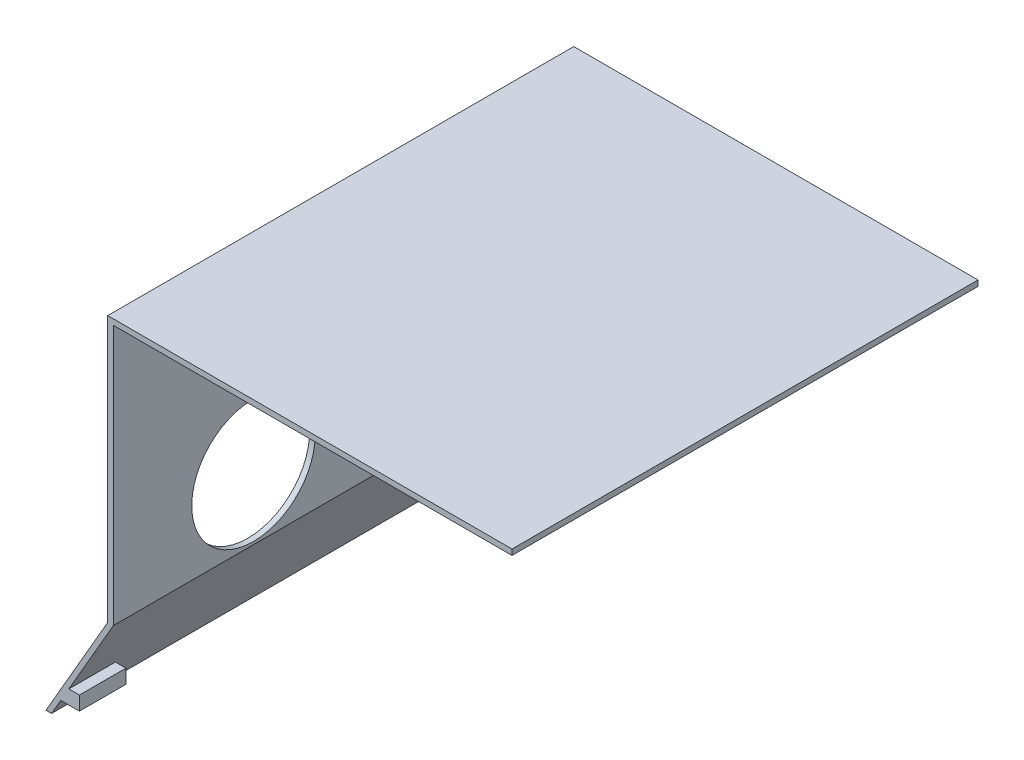
ISO-10303-21;
HEADER;
FILE_DESCRIPTION(('STEP AP214'),'2;1');
FILE_NAME('part.step','',(''),(''),'','','');
FILE_SCHEMA(('AUTOMOTIVE_DESIGN { 1 0 10303 214 1 1 1 1 }'));
ENDSEC;
DATA;
#1=APPLICATION_CONTEXT('core data for automotive mechanical design processes');
#2=APPLICATION_PROTOCOL_DEFINITION('international standard','automotive_design',2000,#1);
#3=PRODUCT_CONTEXT('',#1,'mechanical');
#4=PRODUCT('Part','Part','',(#3));
#5=PRODUCT_RELATED_PRODUCT_CATEGORY('part','',(#4));
#6=PRODUCT_DEFINITION_FORMATION('','',#4);
#7=PRODUCT_DEFINITION_CONTEXT('part definition',#1,'design');
#8=PRODUCT_DEFINITION('design','',#6,#7);
#9=PRODUCT_DEFINITION_SHAPE('','',#8);
#10=(LENGTH_UNIT() NAMED_UNIT(*) SI_UNIT(.MILLI.,.METRE.));
#11=(NAMED_UNIT(*) PLANE_ANGLE_UNIT() SI_UNIT($,.RADIAN.));
#12=(NAMED_UNIT(*) SI_UNIT($,.STERADIAN.) SOLID_ANGLE_UNIT());
#13=UNCERTAINTY_MEASURE_WITH_UNIT(LENGTH_MEASURE(1.E-05),#10,'distance_accuracy_value','');
#14=(GEOMETRIC_REPRESENTATION_CONTEXT(3) GLOBAL_UNCERTAINTY_ASSIGNED_CONTEXT((#13)) GLOBAL_UNIT_ASSIGNED_CONTEXT((#10,
#11,#12)) REPRESENTATION_CONTEXT('',''));
#15=CARTESIAN_POINT('',(0.,0.,0.));
#16=DIRECTION('',(0.,0.,1.));
#17=DIRECTION('',(1.,0.,0.));
#18=AXIS2_PLACEMENT_3D('',#15,#16,#17);
#19=CARTESIAN_POINT('',(100.,79.9596732002877,-100.));
#20=DIRECTION('',(0.,1.,0.));
#21=DIRECTION('',(-1.,0.,0.));
#22=AXIS2_PLACEMENT_3D('',#19,#20,#21);
#23=PLANE('',#22);
#24=DIRECTION('',(-1.,0.,0.));
#25=VECTOR('',#24,1.);
#26=CARTESIAN_POINT('',(100.,79.9596732002877,0.));
#27=LINE('',#26,#25);
#28=CARTESIAN_POINT('',(100.,79.9596732002877,0.));
#29=VERTEX_POINT('',#28);
#30=CARTESIAN_POINT('',(13.2499999999999,79.9596732002877,0.));
#31=VERTEX_POINT('',#30);
#32=EDGE_CURVE('E232',#29,#31,#27,.T.);
#33=ORIENTED_EDGE('',*,*,#32,.F.);
#34=DIRECTION('',(0.,0.,1.));
#35=VECTOR('',#34,1.);
#36=CARTESIAN_POINT('',(100.,79.9596732002877,-100.));
#37=LINE('',#36,#35);
#38=CARTESIAN_POINT('',(100.,79.9596732002877,-100.));
#39=VERTEX_POINT('',#38);
#40=EDGE_CURVE('E11',#39,#29,#37,.T.);
#41=ORIENTED_EDGE('',*,*,#40,.F.);
#42=DIRECTION('',(-1.,0.,0.));
#43=VECTOR('',#42,1.);
#44=CARTESIAN_POINT('',(100.,79.9596732002877,-100.));
#45=LINE('',#44,#43);
#46=CARTESIAN_POINT('',(13.2499999999999,79.9596732002877,-100.));
#47=VERTEX_POINT('',#46);
#48=EDGE_CURVE('E242',#39,#47,#45,.T.);
#49=ORIENTED_EDGE('',*,*,#48,.T.);
#50=DIRECTION('',(0.,0.,1.));
#51=VECTOR('',#50,1.);
#52=CARTESIAN_POINT('',(13.2499999999999,79.9596732002877,-100.));
#53=LINE('',#52,#51);
#54=EDGE_CURVE('E42',#47,#31,#53,.T.);
#55=ORIENTED_EDGE('',*,*,#54,.T.);
#56=EDGE_LOOP('',(#33,#41,#49,#55));
#57=FACE_BOUND('',#56,.T.);
#58=ADVANCED_FACE('F39',(#57),#23,.T.);
#59=CARTESIAN_POINT('',(99.9999999999999,78.7596732002877,-100.));
#60=DIRECTION('',(1.,0.,0.));
#61=DIRECTION('',(0.,1.,0.));
#62=AXIS2_PLACEMENT_3D('',#59,#60,#61);
#63=PLANE('',#62);
#64=DIRECTION('',(0.,1.,0.));
#65=VECTOR('',#64,1.);
#66=CARTESIAN_POINT('',(99.9999999999999,78.7596732002877,0.));
#67=LINE('',#66,#65);
#68=CARTESIAN_POINT('',(99.9999999999999,78.7596732002877,0.));
#69=VERTEX_POINT('',#68);
#70=EDGE_CURVE('E247',#69,#29,#67,.T.);
#71=ORIENTED_EDGE('',*,*,#70,.F.);
#72=DIRECTION('',(0.,0.,1.));
#73=VECTOR('',#72,1.);
#74=CARTESIAN_POINT('',(99.9999999999999,78.7596732002877,-100.));
#75=LINE('',#74,#73);
#76=CARTESIAN_POINT('',(99.9999999999999,78.7596732002877,-100.));
#77=VERTEX_POINT('',#76);
#78=EDGE_CURVE('E48',#77,#69,#75,.T.);
#79=ORIENTED_EDGE('',*,*,#78,.F.);
#80=DIRECTION('',(0.,1.,0.));
#81=VECTOR('',#80,1.);
#82=CARTESIAN_POINT('',(99.9999999999999,78.7596732002877,-100.));
#83=LINE('',#82,#81);
#84=EDGE_CURVE('E271',#77,#39,#83,.T.);
#85=ORIENTED_EDGE('',*,*,#84,.T.);
#86=ORIENTED_EDGE('',*,*,#40,.T.);
#87=EDGE_LOOP('',(#71,#79,#85,#86));
#88=FACE_BOUND('',#87,.T.);
#89=ADVANCED_FACE('F336',(#88),#63,.T.);
#90=CARTESIAN_POINT('',(14.4499999999999,78.7596732002877,-100.));
#91=DIRECTION('',(0.,-1.,0.));
#92=DIRECTION('',(1.,0.,0.));
#93=AXIS2_PLACEMENT_3D('',#90,#91,#92);
#94=PLANE('',#93);
#95=DIRECTION('',(1.,0.,0.));
#96=VECTOR('',#95,1.);
#97=CARTESIAN_POINT('',(14.4499999999999,78.7596732002877,0.));
#98=LINE('',#97,#96);
#99=CARTESIAN_POINT('',(14.4499999999999,78.7596732002877,0.));
#100=VERTEX_POINT('',#99);
#101=EDGE_CURVE('E299',#100,#69,#98,.T.);
#102=ORIENTED_EDGE('',*,*,#101,.F.);
#103=DIRECTION('',(0.,0.,1.));
#104=VECTOR('',#103,1.);
#105=CARTESIAN_POINT('',(14.4499999999999,78.7596732002877,-100.));
#106=LINE('',#105,#104);
#107=CARTESIAN_POINT('',(14.4499999999999,78.7596732002877,-100.));
#108=VERTEX_POINT('',#107);
#109=EDGE_CURVE('E308',#108,#100,#106,.T.);
#110=ORIENTED_EDGE('',*,*,#109,.F.);
#111=DIRECTION('',(1.,0.,0.));
#112=VECTOR('',#111,1.);
#113=CARTESIAN_POINT('',(14.4499999999999,78.7596732002877,-100.));
#114=LINE('',#113,#112);
#115=EDGE_CURVE('E267',#108,#77,#114,.T.);
#116=ORIENTED_EDGE('',*,*,#115,.T.);
#117=ORIENTED_EDGE('',*,*,#78,.T.);
#118=EDGE_LOOP('',(#102,#110,#116,#117));
#119=FACE_BOUND('',#118,.T.);
#120=ADVANCED_FACE('F374',(#119),#94,.T.);
#121=CARTESIAN_POINT('',(14.4499999999999,22.9496732002877,-100.));
#122=DIRECTION('',(1.,0.,0.));
#123=DIRECTION('',(0.,0.,-1.));
#124=AXIS2_PLACEMENT_3D('',#121,#122,#123);
#125=PLANE('',#124);
#126=CARTESIAN_POINT('',(14.4499999999999,36.8,-69.6));
#127=DIRECTION('',(1.,0.,0.));
#128=DIRECTION('',(0.,0.,-1.));
#129=AXIS2_PLACEMENT_3D('',#126,#127,#128);
#130=CIRCLE('',#129,13.25);
#131=CARTESIAN_POINT('',(14.4499999999999,36.8,-82.85));
#132=VERTEX_POINT('',#131);
#133=EDGE_CURVE('E188',#132,#132,#130,.T.);
#134=ORIENTED_EDGE('',*,*,#133,.F.);
#135=EDGE_LOOP('',(#134));
#136=FACE_BOUND('',#135,.T.);
#137=CARTESIAN_POINT('',(14.4499999999999,36.8,-30.07));
#138=DIRECTION('',(1.,0.,0.));
#139=DIRECTION('',(0.,0.,-1.));
#140=AXIS2_PLACEMENT_3D('',#137,#138,#139);
#141=CIRCLE('',#140,13.25);
#142=CARTESIAN_POINT('',(14.4499999999999,36.8,-43.32));
#143=VERTEX_POINT('',#142);
#144=EDGE_CURVE('E548',#143,#143,#141,.T.);
#145=ORIENTED_EDGE('',*,*,#144,.F.);
#146=EDGE_LOOP('',(#145));
#147=FACE_BOUND('',#146,.T.);
#148=DIRECTION('',(0.,1.,0.));
#149=VECTOR('',#148,1.);
#150=CARTESIAN_POINT('',(14.4499999999999,22.9496732002877,0.));
#151=LINE('',#150,#149);
#152=CARTESIAN_POINT('',(14.4499999999999,22.9496732002877,0.));
#153=VERTEX_POINT('',#152);
#154=EDGE_CURVE('E295',#153,#100,#151,.T.);
#155=ORIENTED_EDGE('',*,*,#154,.F.);
#156=DIRECTION('',(0.,0.,1.));
#157=VECTOR('',#156,1.);
#158=CARTESIAN_POINT('',(14.4499999999999,22.9496732002877,-100.));
#159=LINE('',#158,#157);
#160=CARTESIAN_POINT('',(14.4499999999999,22.9496732002877,-100.));
#161=VERTEX_POINT('',#160);
#162=EDGE_CURVE('E311',#161,#153,#159,.T.);
#163=ORIENTED_EDGE('',*,*,#162,.F.);
#164=DIRECTION('',(0.,1.,0.));
#165=VECTOR('',#164,1.);
#166=CARTESIAN_POINT('',(14.4499999999999,22.9496732002877,-100.));
#167=LINE('',#166,#165);
#168=EDGE_CURVE('E263',#161,#108,#167,.T.);
#169=ORIENTED_EDGE('',*,*,#168,.T.);
#170=ORIENTED_EDGE('',*,*,#109,.T.);
#171=EDGE_LOOP('',(#155,#163,#169,#170));
#172=FACE_BOUND('',#171,.T.);
#173=ADVANCED_FACE('F372',(#136,#147,#172),#125,.T.);
#174=CARTESIAN_POINT('',(1.2,0.,-100.));
#175=DIRECTION('',(0.86602540378444,-0.499999999999998,0.));
#176=DIRECTION('',(0.499999999999998,0.86602540378444,0.));
#177=AXIS2_PLACEMENT_3D('',#174,#175,#176);
#178=PLANE('',#177);
#179=DIRECTION('',(0.,0.,-1.));
#180=VECTOR('',#179,1.);
#181=CARTESIAN_POINT('',(3.16299091524473,3.4,-90.));
#182=LINE('',#181,#180);
#183=CARTESIAN_POINT('',(3.16299091524472,3.4,-90.));
#184=VERTEX_POINT('',#183);
#185=CARTESIAN_POINT('',(3.16299091524472,3.4,-100.));
#186=VERTEX_POINT('',#185);
#187=EDGE_CURVE('E56',#184,#186,#182,.T.);
#188=ORIENTED_EDGE('',*,*,#187,.F.);
#189=DIRECTION('',(0.5,0.866025403784439,0.));
#190=VECTOR('',#189,1.);
#191=CARTESIAN_POINT('',(4.8950417228136,6.4,-90.));
#192=LINE('',#191,#190);
#193=CARTESIAN_POINT('',(4.89504172281358,6.4,-90.));
#194=VERTEX_POINT('',#193);
#195=EDGE_CURVE('E60',#184,#194,#192,.T.);
#196=ORIENTED_EDGE('',*,*,#195,.T.);
#197=DIRECTION('',(0.,0.,-1.));
#198=VECTOR('',#197,1.);
#199=CARTESIAN_POINT('',(4.8950417228136,6.4,-90.));
#200=LINE('',#199,#198);
#201=CARTESIAN_POINT('',(4.8950417228136,6.4,-100.));
#202=VERTEX_POINT('',#201);
#203=EDGE_CURVE('E165',#194,#202,#200,.T.);
#204=ORIENTED_EDGE('',*,*,#203,.T.);
#205=DIRECTION('',(0.499999999999998,0.86602540378444,0.));
#206=VECTOR('',#205,1.);
#207=CARTESIAN_POINT('',(1.2,0.,-100.));
#208=LINE('',#207,#206);
#209=EDGE_CURVE('E259',#202,#161,#208,.T.);
#210=ORIENTED_EDGE('',*,*,#209,.T.);
#211=ORIENTED_EDGE('',*,*,#162,.T.);
#212=DIRECTION('',(0.499999999999998,0.86602540378444,0.));
#213=VECTOR('',#212,1.);
#214=CARTESIAN_POINT('',(1.2,0.,0.));
#215=LINE('',#214,#213);
#216=CARTESIAN_POINT('',(4.89504172281358,6.4,0.));
#217=VERTEX_POINT('',#216);
#218=EDGE_CURVE('E290',#217,#153,#215,.T.);
#219=ORIENTED_EDGE('',*,*,#218,.F.);
#220=DIRECTION('',(0.,0.,1.));
#221=VECTOR('',#220,1.);
#222=CARTESIAN_POINT('',(4.8950417228136,6.4,-10.));
#223=LINE('',#222,#221);
#224=CARTESIAN_POINT('',(4.8950417228136,6.4,-10.));
#225=VERTEX_POINT('',#224);
#226=EDGE_CURVE('E228',#225,#217,#223,.T.);
#227=ORIENTED_EDGE('',*,*,#226,.F.);
#228=DIRECTION('',(-0.5,-0.866025403784439,0.));
#229=VECTOR('',#228,1.);
#230=CARTESIAN_POINT('',(4.8950417228136,6.4,-10.));
#231=LINE('',#230,#229);
#232=CARTESIAN_POINT('',(3.16299091524473,3.4,-10.));
#233=VERTEX_POINT('',#232);
#234=EDGE_CURVE('E201',#225,#233,#231,.T.);
#235=ORIENTED_EDGE('',*,*,#234,.T.);
#236=DIRECTION('',(0.,0.,1.));
#237=VECTOR('',#236,1.);
#238=CARTESIAN_POINT('',(3.16299091524473,3.4,-10.));
#239=LINE('',#238,#237);
#240=CARTESIAN_POINT('',(3.16299091524473,3.4,0.));
#241=VERTEX_POINT('',#240);
#242=EDGE_CURVE('E218',#233,#241,#239,.T.);
#243=ORIENTED_EDGE('',*,*,#242,.T.);
#244=CARTESIAN_POINT('',(1.2,0.,0.));
#245=VERTEX_POINT('',#244);
#246=EDGE_CURVE('E291',#245,#241,#215,.T.);
#247=ORIENTED_EDGE('',*,*,#246,.F.);
#248=DIRECTION('',(0.,0.,1.));
#249=VECTOR('',#248,1.);
#250=CARTESIAN_POINT('',(1.2,0.,-100.));
#251=LINE('',#250,#249);
#252=CARTESIAN_POINT('',(1.2,0.,-100.));
#253=VERTEX_POINT('',#252);
#254=EDGE_CURVE('E315',#253,#245,#251,.T.);
#255=ORIENTED_EDGE('',*,*,#254,.F.);
#256=EDGE_CURVE('E260',#253,#186,#208,.T.);
#257=ORIENTED_EDGE('',*,*,#256,.T.);
#258=EDGE_LOOP('',(#188,#196,#204,#210,#211,#219,#227,#235,#243,#247,#255,#257));
#259=FACE_BOUND('',#258,.T.);
#260=ADVANCED_FACE('F350',(#259),#178,.T.);
#261=CARTESIAN_POINT('',(0.,0.,-100.));
#262=DIRECTION('',(0.,-1.,0.));
#263=DIRECTION('',(0.,0.,-1.));
#264=AXIS2_PLACEMENT_3D('',#261,#262,#263);
#265=PLANE('',#264);
#266=DIRECTION('',(1.,0.,0.));
#267=VECTOR('',#266,1.);
#268=CARTESIAN_POINT('',(0.,0.,0.));
#269=LINE('',#268,#267);
#270=CARTESIAN_POINT('',(0.,0.,0.));
#271=VERTEX_POINT('',#270);
#272=EDGE_CURVE('E286',#271,#245,#269,.T.);
#273=ORIENTED_EDGE('',*,*,#272,.F.);
#274=DIRECTION('',(0.,0.,1.));
#275=VECTOR('',#274,1.);
#276=CARTESIAN_POINT('',(0.,0.,-100.));
#277=LINE('',#276,#275);
#278=CARTESIAN_POINT('',(0.,0.,-100.));
#279=VERTEX_POINT('',#278);
#280=EDGE_CURVE('E318',#279,#271,#277,.T.);
#281=ORIENTED_EDGE('',*,*,#280,.F.);
#282=DIRECTION('',(1.,0.,0.));
#283=VECTOR('',#282,1.);
#284=CARTESIAN_POINT('',(0.,0.,-100.));
#285=LINE('',#284,#283);
#286=EDGE_CURVE('E255',#279,#253,#285,.T.);
#287=ORIENTED_EDGE('',*,*,#286,.T.);
#288=ORIENTED_EDGE('',*,*,#254,.T.);
#289=EDGE_LOOP('',(#273,#281,#287,#288));
#290=FACE_BOUND('',#289,.T.);
#291=ADVANCED_FACE('F349',(#290),#265,.T.);
#292=CARTESIAN_POINT('',(13.2499999999999,22.9496732002877,-100.));
#293=DIRECTION('',(-0.86602540378444,0.499999999999998,0.));
#294=DIRECTION('',(-0.499999999999998,-0.86602540378444,0.));
#295=AXIS2_PLACEMENT_3D('',#292,#293,#294);
#296=PLANE('',#295);
#297=DIRECTION('',(-0.499999999999998,-0.86602540378444,0.));
#298=VECTOR('',#297,1.);
#299=CARTESIAN_POINT('',(13.2499999999999,22.9496732002877,0.));
#300=LINE('',#299,#298);
#301=CARTESIAN_POINT('',(13.2499999999999,22.9496732002877,0.));
#302=VERTEX_POINT('',#301);
#303=EDGE_CURVE('E282',#302,#271,#300,.T.);
#304=ORIENTED_EDGE('',*,*,#303,.F.);
#305=DIRECTION('',(0.,0.,1.));
#306=VECTOR('',#305,1.);
#307=CARTESIAN_POINT('',(13.2499999999999,22.9496732002877,-100.));
#308=LINE('',#307,#306);
#309=CARTESIAN_POINT('',(13.2499999999999,22.9496732002877,-100.));
#310=VERTEX_POINT('',#309);
#311=EDGE_CURVE('E320',#310,#302,#308,.T.);
#312=ORIENTED_EDGE('',*,*,#311,.F.);
#313=DIRECTION('',(-0.499999999999998,-0.86602540378444,0.));
#314=VECTOR('',#313,1.);
#315=CARTESIAN_POINT('',(13.2499999999999,22.9496732002877,-100.));
#316=LINE('',#315,#314);
#317=EDGE_CURVE('E251',#310,#279,#316,.T.);
#318=ORIENTED_EDGE('',*,*,#317,.T.);
#319=ORIENTED_EDGE('',*,*,#280,.T.);
#320=EDGE_LOOP('',(#304,#312,#318,#319));
#321=FACE_BOUND('',#320,.T.);
#322=ADVANCED_FACE('F345',(#321),#296,.T.);
#323=CARTESIAN_POINT('',(13.2499999999999,79.9596732002877,-100.));
#324=DIRECTION('',(-1.,0.,0.));
#325=DIRECTION('',(0.,-1.,0.));
#326=AXIS2_PLACEMENT_3D('',#323,#324,#325);
#327=PLANE('',#326);
#328=CARTESIAN_POINT('',(13.2499999999999,36.8,-69.6));
#329=DIRECTION('',(-1.,0.,0.));
#330=DIRECTION('',(0.,-1.,0.));
#331=AXIS2_PLACEMENT_3D('',#328,#329,#330);
#332=CIRCLE('',#331,13.25);
#333=CARTESIAN_POINT('',(13.2499999999999,23.55,-69.6));
#334=VERTEX_POINT('',#333);
#335=EDGE_CURVE('E546',#334,#334,#332,.T.);
#336=ORIENTED_EDGE('',*,*,#335,.F.);
#337=EDGE_LOOP('',(#336));
#338=FACE_BOUND('',#337,.T.);
#339=CARTESIAN_POINT('',(13.2499999999999,36.8,-30.07));
#340=DIRECTION('',(-1.,0.,0.));
#341=DIRECTION('',(0.,-1.,0.));
#342=AXIS2_PLACEMENT_3D('',#339,#340,#341);
#343=CIRCLE('',#342,13.25);
#344=CARTESIAN_POINT('',(13.2499999999999,23.55,-30.07));
#345=VERTEX_POINT('',#344);
#346=EDGE_CURVE('E549',#345,#345,#343,.T.);
#347=ORIENTED_EDGE('',*,*,#346,.F.);
#348=EDGE_LOOP('',(#347));
#349=FACE_BOUND('',#348,.T.);
#350=DIRECTION('',(0.,-1.,0.));
#351=VECTOR('',#350,1.);
#352=CARTESIAN_POINT('',(13.2499999999999,79.9596732002877,0.));
#353=LINE('',#352,#351);
#354=EDGE_CURVE('E278',#31,#302,#353,.T.);
#355=ORIENTED_EDGE('',*,*,#354,.F.);
#356=ORIENTED_EDGE('',*,*,#54,.F.);
#357=DIRECTION('',(0.,-1.,0.));
#358=VECTOR('',#357,1.);
#359=CARTESIAN_POINT('',(13.2499999999999,79.9596732002877,-100.));
#360=LINE('',#359,#358);
#361=EDGE_CURVE('E246',#47,#310,#360,.T.);
#362=ORIENTED_EDGE('',*,*,#361,.T.);
#363=ORIENTED_EDGE('',*,*,#311,.T.);
#364=EDGE_LOOP('',(#355,#356,#362,#363));
#365=FACE_BOUND('',#364,.T.);
#366=ADVANCED_FACE('F330',(#338,#349,#365),#327,.T.);
#367=CARTESIAN_POINT('',(0.,0.,-100.));
#368=DIRECTION('',(0.,0.,1.));
#369=DIRECTION('',(1.,0.,0.));
#370=AXIS2_PLACEMENT_3D('',#367,#368,#369);
#371=PLANE('',#370);
#372=ORIENTED_EDGE('',*,*,#48,.F.);
#373=ORIENTED_EDGE('',*,*,#84,.F.);
#374=ORIENTED_EDGE('',*,*,#115,.F.);
#375=ORIENTED_EDGE('',*,*,#168,.F.);
#376=ORIENTED_EDGE('',*,*,#209,.F.);
#377=DIRECTION('',(1.,0.,0.));
#378=VECTOR('',#377,1.);
#379=CARTESIAN_POINT('',(7.16299091524473,6.4,-100.));
#380=LINE('',#379,#378);
#381=CARTESIAN_POINT('',(7.16299091524473,6.4,-100.));
#382=VERTEX_POINT('',#381);
#383=EDGE_CURVE('E185',#202,#382,#380,.T.);
#384=ORIENTED_EDGE('',*,*,#383,.T.);
#385=DIRECTION('',(0.,-1.,0.));
#386=VECTOR('',#385,1.);
#387=CARTESIAN_POINT('',(7.16299091524473,3.4,-100.));
#388=LINE('',#387,#386);
#389=CARTESIAN_POINT('',(7.16299091524473,3.4,-100.));
#390=VERTEX_POINT('',#389);
#391=EDGE_CURVE('E158',#382,#390,#388,.T.);
#392=ORIENTED_EDGE('',*,*,#391,.T.);
#393=DIRECTION('',(-1.,0.,0.));
#394=VECTOR('',#393,1.);
#395=CARTESIAN_POINT('',(3.16299091524473,3.4,-100.));
#396=LINE('',#395,#394);
#397=EDGE_CURVE('E179',#390,#186,#396,.T.);
#398=ORIENTED_EDGE('',*,*,#397,.T.);
#399=ORIENTED_EDGE('',*,*,#256,.F.);
#400=ORIENTED_EDGE('',*,*,#286,.F.);
#401=ORIENTED_EDGE('',*,*,#317,.F.);
#402=ORIENTED_EDGE('',*,*,#361,.F.);
#403=EDGE_LOOP('',(#372,#373,#374,#375,#376,#384,#392,#398,#399,#400,#401,#402));
#404=FACE_BOUND('',#403,.T.);
#405=ADVANCED_FACE('F339',(#404),#371,.F.);
#406=CARTESIAN_POINT('',(0.,0.,0.));
#407=DIRECTION('',(0.,0.,1.));
#408=DIRECTION('',(1.,0.,0.));
#409=AXIS2_PLACEMENT_3D('',#406,#407,#408);
#410=PLANE('',#409);
#411=ORIENTED_EDGE('',*,*,#32,.T.);
#412=ORIENTED_EDGE('',*,*,#354,.T.);
#413=ORIENTED_EDGE('',*,*,#303,.T.);
#414=ORIENTED_EDGE('',*,*,#272,.T.);
#415=ORIENTED_EDGE('',*,*,#246,.T.);
#416=DIRECTION('',(1.,0.,0.));
#417=VECTOR('',#416,1.);
#418=CARTESIAN_POINT('',(3.16299091524473,3.4,0.));
#419=LINE('',#418,#417);
#420=CARTESIAN_POINT('',(7.16299091524473,3.4,0.));
#421=VERTEX_POINT('',#420);
#422=EDGE_CURVE('E196',#241,#421,#419,.T.);
#423=ORIENTED_EDGE('',*,*,#422,.T.);
#424=DIRECTION('',(0.,1.,0.));
#425=VECTOR('',#424,1.);
#426=CARTESIAN_POINT('',(7.16299091524473,3.4,0.));
#427=LINE('',#426,#425);
#428=CARTESIAN_POINT('',(7.16299091524473,6.4,0.));
#429=VERTEX_POINT('',#428);
#430=EDGE_CURVE('E222',#421,#429,#427,.T.);
#431=ORIENTED_EDGE('',*,*,#430,.T.);
#432=DIRECTION('',(-1.,0.,0.));
#433=VECTOR('',#432,1.);
#434=CARTESIAN_POINT('',(7.16299091524473,6.4,0.));
#435=LINE('',#434,#433);
#436=EDGE_CURVE('E206',#429,#217,#435,.T.);
#437=ORIENTED_EDGE('',*,*,#436,.T.);
#438=ORIENTED_EDGE('',*,*,#218,.T.);
#439=ORIENTED_EDGE('',*,*,#154,.T.);
#440=ORIENTED_EDGE('',*,*,#101,.T.);
#441=ORIENTED_EDGE('',*,*,#70,.T.);
#442=EDGE_LOOP('',(#411,#412,#413,#414,#415,#423,#431,#437,#438,#439,#440,#441));
#443=FACE_BOUND('',#442,.T.);
#444=ADVANCED_FACE('F332',(#443),#410,.T.);
#445=CARTESIAN_POINT('',(7.16299091524473,6.4,-10.));
#446=DIRECTION('',(0.,1.,0.));
#447=DIRECTION('',(0.,0.,1.));
#448=AXIS2_PLACEMENT_3D('',#445,#446,#447);
#449=PLANE('',#448);
#450=ORIENTED_EDGE('',*,*,#436,.F.);
#451=DIRECTION('',(0.,0.,1.));
#452=VECTOR('',#451,1.);
#453=CARTESIAN_POINT('',(7.16299091524473,6.4,-10.));
#454=LINE('',#453,#452);
#455=CARTESIAN_POINT('',(7.16299091524473,6.4,-10.));
#456=VERTEX_POINT('',#455);
#457=EDGE_CURVE('E233',#456,#429,#454,.T.);
#458=ORIENTED_EDGE('',*,*,#457,.F.);
#459=DIRECTION('',(-1.,0.,0.));
#460=VECTOR('',#459,1.);
#461=CARTESIAN_POINT('',(7.16299091524473,6.4,-10.));
#462=LINE('',#461,#460);
#463=EDGE_CURVE('E214',#456,#225,#462,.T.);
#464=ORIENTED_EDGE('',*,*,#463,.T.);
#465=ORIENTED_EDGE('',*,*,#226,.T.);
#466=EDGE_LOOP('',(#450,#458,#464,#465));
#467=FACE_BOUND('',#466,.T.);
#468=ADVANCED_FACE('F364',(#467),#449,.T.);
#469=CARTESIAN_POINT('',(7.16299091524473,3.4,-10.));
#470=DIRECTION('',(1.,0.,0.));
#471=DIRECTION('',(0.,0.,-1.));
#472=AXIS2_PLACEMENT_3D('',#469,#470,#471);
#473=PLANE('',#472);
#474=ORIENTED_EDGE('',*,*,#430,.F.);
#475=DIRECTION('',(0.,0.,1.));
#476=VECTOR('',#475,1.);
#477=CARTESIAN_POINT('',(7.16299091524473,3.4,-10.));
#478=LINE('',#477,#476);
#479=CARTESIAN_POINT('',(7.16299091524473,3.4,-10.));
#480=VERTEX_POINT('',#479);
#481=EDGE_CURVE('E236',#480,#421,#478,.T.);
#482=ORIENTED_EDGE('',*,*,#481,.F.);
#483=DIRECTION('',(0.,1.,0.));
#484=VECTOR('',#483,1.);
#485=CARTESIAN_POINT('',(7.16299091524473,3.4,-10.));
#486=LINE('',#485,#484);
#487=EDGE_CURVE('E210',#480,#456,#486,.T.);
#488=ORIENTED_EDGE('',*,*,#487,.T.);
#489=ORIENTED_EDGE('',*,*,#457,.T.);
#490=EDGE_LOOP('',(#474,#482,#488,#489));
#491=FACE_BOUND('',#490,.T.);
#492=ADVANCED_FACE('F361',(#491),#473,.T.);
#493=CARTESIAN_POINT('',(3.16299091524473,3.4,-10.));
#494=DIRECTION('',(0.,-1.,0.));
#495=DIRECTION('',(0.,0.,-1.));
#496=AXIS2_PLACEMENT_3D('',#493,#494,#495);
#497=PLANE('',#496);
#498=ORIENTED_EDGE('',*,*,#422,.F.);
#499=ORIENTED_EDGE('',*,*,#242,.F.);
#500=DIRECTION('',(1.,0.,0.));
#501=VECTOR('',#500,1.);
#502=CARTESIAN_POINT('',(3.16299091524473,3.4,-10.));
#503=LINE('',#502,#501);
#504=EDGE_CURVE('E205',#233,#480,#503,.T.);
#505=ORIENTED_EDGE('',*,*,#504,.T.);
#506=ORIENTED_EDGE('',*,*,#481,.T.);
#507=EDGE_LOOP('',(#498,#499,#505,#506));
#508=FACE_BOUND('',#507,.T.);
#509=ADVANCED_FACE('F354',(#508),#497,.T.);
#510=CARTESIAN_POINT('',(0.,0.,-10.));
#511=DIRECTION('',(0.,0.,1.));
#512=DIRECTION('',(1.,0.,0.));
#513=AXIS2_PLACEMENT_3D('',#510,#511,#512);
#514=PLANE('',#513);
#515=ORIENTED_EDGE('',*,*,#234,.F.);
#516=ORIENTED_EDGE('',*,*,#463,.F.);
#517=ORIENTED_EDGE('',*,*,#487,.F.);
#518=ORIENTED_EDGE('',*,*,#504,.F.);
#519=EDGE_LOOP('',(#515,#516,#517,#518));
#520=FACE_BOUND('',#519,.T.);
#521=ADVANCED_FACE('F357',(#520),#514,.F.);
#522=CARTESIAN_POINT('',(3.16299091524473,3.4,-90.));
#523=DIRECTION('',(0.,-1.,0.));
#524=DIRECTION('',(0.,0.,-1.));
#525=AXIS2_PLACEMENT_3D('',#522,#523,#524);
#526=PLANE('',#525);
#527=ORIENTED_EDGE('',*,*,#397,.F.);
#528=DIRECTION('',(0.,0.,-1.));
#529=VECTOR('',#528,1.);
#530=CARTESIAN_POINT('',(7.16299091524473,3.4,-90.));
#531=LINE('',#530,#529);
#532=CARTESIAN_POINT('',(7.16299091524473,3.4,-90.));
#533=VERTEX_POINT('',#532);
#534=EDGE_CURVE('E164',#533,#390,#531,.T.);
#535=ORIENTED_EDGE('',*,*,#534,.F.);
#536=DIRECTION('',(-1.,0.,0.));
#537=VECTOR('',#536,1.);
#538=CARTESIAN_POINT('',(3.16299091524473,3.4,-90.));
#539=LINE('',#538,#537);
#540=EDGE_CURVE('E172',#533,#184,#539,.T.);
#541=ORIENTED_EDGE('',*,*,#540,.T.);
#542=ORIENTED_EDGE('',*,*,#187,.T.);
#543=EDGE_LOOP('',(#527,#535,#541,#542));
#544=FACE_BOUND('',#543,.T.);
#545=ADVANCED_FACE('F459',(#544),#526,.T.);
#546=CARTESIAN_POINT('',(7.16299091524473,3.4,-90.));
#547=DIRECTION('',(1.,0.,0.));
#548=DIRECTION('',(0.,0.,-1.));
#549=AXIS2_PLACEMENT_3D('',#546,#547,#548);
#550=PLANE('',#549);
#551=ORIENTED_EDGE('',*,*,#391,.F.);
#552=DIRECTION('',(0.,0.,-1.));
#553=VECTOR('',#552,1.);
#554=CARTESIAN_POINT('',(7.16299091524473,6.4,-90.));
#555=LINE('',#554,#553);
#556=CARTESIAN_POINT('',(7.16299091524473,6.4,-90.));
#557=VERTEX_POINT('',#556);
#558=EDGE_CURVE('E152',#557,#382,#555,.T.);
#559=ORIENTED_EDGE('',*,*,#558,.F.);
#560=DIRECTION('',(0.,-1.,0.));
#561=VECTOR('',#560,1.);
#562=CARTESIAN_POINT('',(7.16299091524473,3.4,-90.));
#563=LINE('',#562,#561);
#564=EDGE_CURVE('E155',#557,#533,#563,.T.);
#565=ORIENTED_EDGE('',*,*,#564,.T.);
#566=ORIENTED_EDGE('',*,*,#534,.T.);
#567=EDGE_LOOP('',(#551,#559,#565,#566));
#568=FACE_BOUND('',#567,.T.);
#569=ADVANCED_FACE('F154',(#568),#550,.T.);
#570=CARTESIAN_POINT('',(7.16299091524473,6.4,-90.));
#571=DIRECTION('',(0.,1.,0.));
#572=DIRECTION('',(0.,0.,1.));
#573=AXIS2_PLACEMENT_3D('',#570,#571,#572);
#574=PLANE('',#573);
#575=ORIENTED_EDGE('',*,*,#383,.F.);
#576=ORIENTED_EDGE('',*,*,#203,.F.);
#577=DIRECTION('',(1.,0.,0.));
#578=VECTOR('',#577,1.);
#579=CARTESIAN_POINT('',(7.16299091524473,6.4,-90.));
#580=LINE('',#579,#578);
#581=EDGE_CURVE('E170',#194,#557,#580,.T.);
#582=ORIENTED_EDGE('',*,*,#581,.T.);
#583=ORIENTED_EDGE('',*,*,#558,.T.);
#584=EDGE_LOOP('',(#575,#576,#582,#583));
#585=FACE_BOUND('',#584,.T.);
#586=ADVANCED_FACE('F175',(#585),#574,.T.);
#587=CARTESIAN_POINT('',(0.,0.,-90.));
#588=DIRECTION('',(0.,0.,1.));
#589=DIRECTION('',(1.,0.,0.));
#590=AXIS2_PLACEMENT_3D('',#587,#588,#589);
#591=PLANE('',#590);
#592=ORIENTED_EDGE('',*,*,#195,.F.);
#593=ORIENTED_EDGE('',*,*,#540,.F.);
#594=ORIENTED_EDGE('',*,*,#564,.F.);
#595=ORIENTED_EDGE('',*,*,#581,.F.);
#596=EDGE_LOOP('',(#592,#593,#594,#595));
#597=FACE_BOUND('',#596,.T.);
#598=ADVANCED_FACE('F169',(#597),#591,.T.);
#599=CARTESIAN_POINT('',(23.2499999999999,36.8,-30.07));
#600=DIRECTION('',(-1.,0.,0.));
#601=DIRECTION('',(0.,-1.,0.));
#602=AXIS2_PLACEMENT_3D('',#599,#600,#601);
#603=CYLINDRICAL_SURFACE('',#602,13.25);
#604=ORIENTED_EDGE('',*,*,#144,.T.);
#605=EDGE_LOOP('',(#604));
#606=FACE_BOUND('',#605,.T.);
#607=ORIENTED_EDGE('',*,*,#346,.T.);
#608=EDGE_LOOP('',(#607));
#609=FACE_BOUND('',#608,.T.);
#610=ADVANCED_FACE('F507',(#606,#609),#603,.F.);
#611=CARTESIAN_POINT('',(23.2499999999999,36.8,-69.6));
#612=DIRECTION('',(-1.,0.,0.));
#613=DIRECTION('',(0.,-1.,0.));
#614=AXIS2_PLACEMENT_3D('',#611,#612,#613);
#615=CYLINDRICAL_SURFACE('',#614,13.25);
#616=ORIENTED_EDGE('',*,*,#133,.T.);
#617=EDGE_LOOP('',(#616));
#618=FACE_BOUND('',#617,.T.);
#619=ORIENTED_EDGE('',*,*,#335,.T.);
#620=EDGE_LOOP('',(#619));
#621=FACE_BOUND('',#620,.T.);
#622=ADVANCED_FACE('F527',(#618,#621),#615,.F.);
#623=CLOSED_SHELL('',(#58,#89,#120,#173,#260,#291,#322,#366,#405,#444,#468,#492,#509,#521,#545,
#569,#586,#598,#610,#622));
#624=MANIFOLD_SOLID_BREP('B2',#623);
#625=ADVANCED_BREP_SHAPE_REPRESENTATION('',(#18,#624),#14);
#626=SHAPE_DEFINITION_REPRESENTATION(#9,#625);
ENDSEC;
END-ISO-10303-21;
